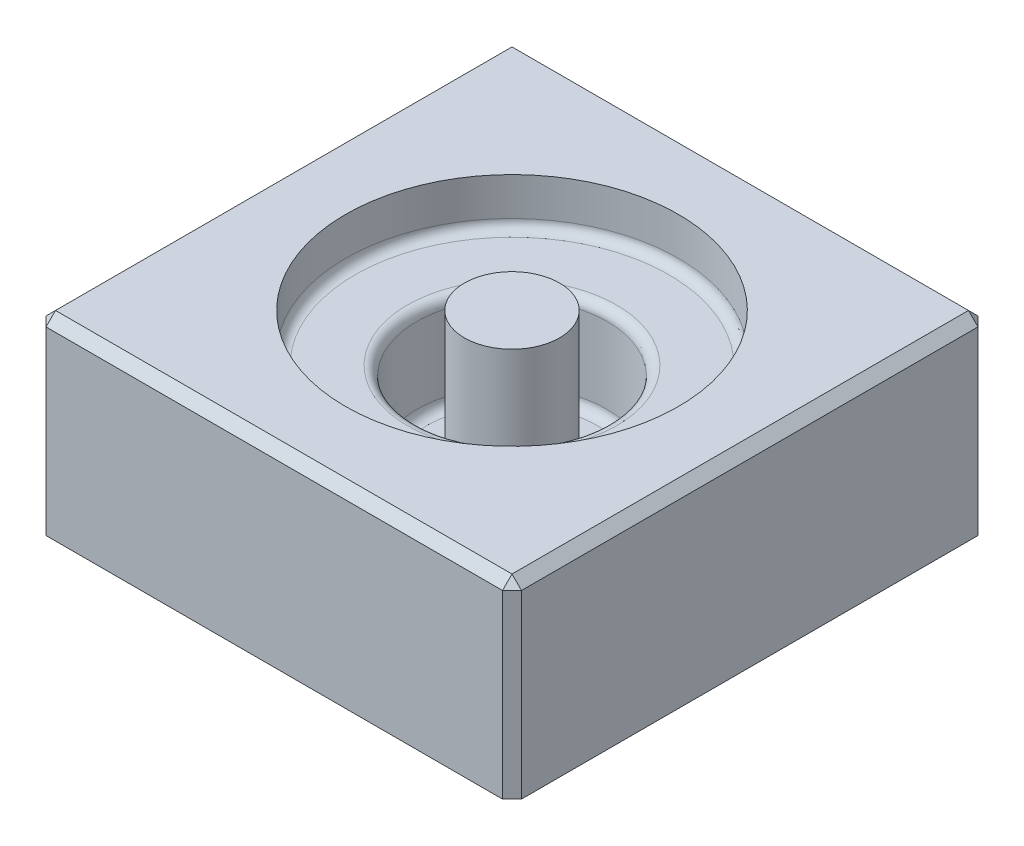
ISO-10303-21;
HEADER;
FILE_DESCRIPTION(('STEP AP214'),'2;1');
FILE_NAME('part.step','',(''),(''),'','','');
FILE_SCHEMA(('AUTOMOTIVE_DESIGN { 1 0 10303 214 1 1 1 1 }'));
ENDSEC;
DATA;
#1=APPLICATION_CONTEXT('core data for automotive mechanical design processes');
#2=APPLICATION_PROTOCOL_DEFINITION('international standard','automotive_design',2000,#1);
#3=PRODUCT_CONTEXT('',#1,'mechanical');
#4=PRODUCT('Part','Part','',(#3));
#5=PRODUCT_RELATED_PRODUCT_CATEGORY('part','',(#4));
#6=PRODUCT_DEFINITION_FORMATION('','',#4);
#7=PRODUCT_DEFINITION_CONTEXT('part definition',#1,'design');
#8=PRODUCT_DEFINITION('design','',#6,#7);
#9=PRODUCT_DEFINITION_SHAPE('','',#8);
#10=(LENGTH_UNIT() NAMED_UNIT(*) SI_UNIT(.MILLI.,.METRE.));
#11=(NAMED_UNIT(*) PLANE_ANGLE_UNIT() SI_UNIT($,.RADIAN.));
#12=(NAMED_UNIT(*) SI_UNIT($,.STERADIAN.) SOLID_ANGLE_UNIT());
#13=UNCERTAINTY_MEASURE_WITH_UNIT(LENGTH_MEASURE(1.E-05),#10,'distance_accuracy_value','');
#14=(GEOMETRIC_REPRESENTATION_CONTEXT(3) GLOBAL_UNCERTAINTY_ASSIGNED_CONTEXT((#13)) GLOBAL_UNIT_ASSIGNED_CONTEXT((#10,
#11,#12)) REPRESENTATION_CONTEXT('',''));
#15=CARTESIAN_POINT('',(0.,0.,0.));
#16=DIRECTION('',(0.,0.,1.));
#17=DIRECTION('',(1.,0.,0.));
#18=AXIS2_PLACEMENT_3D('',#15,#16,#17);
#19=CARTESIAN_POINT('',(31.75,25.4,-31.75));
#20=DIRECTION('',(-1.,0.,0.));
#21=DIRECTION('',(0.,0.,1.));
#22=AXIS2_PLACEMENT_3D('',#19,#20,#21);
#23=PLANE('',#22);
#24=DIRECTION('',(0.,0.,-1.));
#25=VECTOR('',#24,1.);
#26=CARTESIAN_POINT('',(31.75,0.,-31.75));
#27=LINE('',#26,#25);
#28=CARTESIAN_POINT('',(31.75,0.,30.48));
#29=VERTEX_POINT('',#28);
#30=CARTESIAN_POINT('',(31.75,0.,-30.48));
#31=VERTEX_POINT('',#30);
#32=EDGE_CURVE('E238',#29,#31,#27,.T.);
#33=ORIENTED_EDGE('',*,*,#32,.T.);
#34=DIRECTION('',(0.,1.,0.));
#35=VECTOR('',#34,1.);
#36=CARTESIAN_POINT('',(31.75,25.4,-30.48));
#37=LINE('',#36,#35);
#38=CARTESIAN_POINT('',(31.75,24.13,-30.48));
#39=VERTEX_POINT('',#38);
#40=EDGE_CURVE('E189',#31,#39,#37,.T.);
#41=ORIENTED_EDGE('',*,*,#40,.T.);
#42=DIRECTION('',(0.,0.,1.));
#43=VECTOR('',#42,1.);
#44=CARTESIAN_POINT('',(31.75,24.13,31.75));
#45=LINE('',#44,#43);
#46=CARTESIAN_POINT('',(31.75,24.13,30.48));
#47=VERTEX_POINT('',#46);
#48=EDGE_CURVE('E185',#39,#47,#45,.T.);
#49=ORIENTED_EDGE('',*,*,#48,.T.);
#50=DIRECTION('',(0.,-1.,0.));
#51=VECTOR('',#50,1.);
#52=CARTESIAN_POINT('',(31.75,25.4,30.48));
#53=LINE('',#52,#51);
#54=EDGE_CURVE('E187',#47,#29,#53,.T.);
#55=ORIENTED_EDGE('',*,*,#54,.T.);
#56=EDGE_LOOP('',(#33,#41,#49,#55));
#57=FACE_BOUND('',#56,.T.);
#58=ADVANCED_FACE('F33',(#57),#23,.F.);
#59=CARTESIAN_POINT('',(-31.75,25.4,-31.75));
#60=DIRECTION('',(0.,0.,1.));
#61=DIRECTION('',(1.,0.,0.));
#62=AXIS2_PLACEMENT_3D('',#59,#60,#61);
#63=PLANE('',#62);
#64=DIRECTION('',(-1.,0.,0.));
#65=VECTOR('',#64,1.);
#66=CARTESIAN_POINT('',(-31.75,0.,-31.75));
#67=LINE('',#66,#65);
#68=CARTESIAN_POINT('',(30.48,0.,-31.75));
#69=VERTEX_POINT('',#68);
#70=CARTESIAN_POINT('',(-30.48,0.,-31.75));
#71=VERTEX_POINT('',#70);
#72=EDGE_CURVE('E145',#69,#71,#67,.T.);
#73=ORIENTED_EDGE('',*,*,#72,.T.);
#74=DIRECTION('',(0.,1.,0.));
#75=VECTOR('',#74,1.);
#76=CARTESIAN_POINT('',(-30.48,25.4,-31.75));
#77=LINE('',#76,#75);
#78=CARTESIAN_POINT('',(-30.48,24.13,-31.75));
#79=VERTEX_POINT('',#78);
#80=EDGE_CURVE('E183',#71,#79,#77,.T.);
#81=ORIENTED_EDGE('',*,*,#80,.T.);
#82=DIRECTION('',(1.,0.,0.));
#83=VECTOR('',#82,1.);
#84=CARTESIAN_POINT('',(31.75,24.13,-31.75));
#85=LINE('',#84,#83);
#86=CARTESIAN_POINT('',(30.48,24.13,-31.75));
#87=VERTEX_POINT('',#86);
#88=EDGE_CURVE('E179',#79,#87,#85,.T.);
#89=ORIENTED_EDGE('',*,*,#88,.T.);
#90=DIRECTION('',(0.,-1.,0.));
#91=VECTOR('',#90,1.);
#92=CARTESIAN_POINT('',(30.48,25.4,-31.75));
#93=LINE('',#92,#91);
#94=EDGE_CURVE('E181',#87,#69,#93,.T.);
#95=ORIENTED_EDGE('',*,*,#94,.T.);
#96=EDGE_LOOP('',(#73,#81,#89,#95));
#97=FACE_BOUND('',#96,.T.);
#98=ADVANCED_FACE('F246',(#97),#63,.F.);
#99=CARTESIAN_POINT('',(-31.75,25.4,-31.75));
#100=DIRECTION('',(1.,0.,0.));
#101=DIRECTION('',(0.,0.,-1.));
#102=AXIS2_PLACEMENT_3D('',#99,#100,#101);
#103=PLANE('',#102);
#104=DIRECTION('',(0.,0.,1.));
#105=VECTOR('',#104,1.);
#106=CARTESIAN_POINT('',(-31.75,0.,-31.75));
#107=LINE('',#106,#105);
#108=CARTESIAN_POINT('',(-31.75,0.,-30.48));
#109=VERTEX_POINT('',#108);
#110=CARTESIAN_POINT('',(-31.75,0.,30.48));
#111=VERTEX_POINT('',#110);
#112=EDGE_CURVE('E140',#109,#111,#107,.T.);
#113=ORIENTED_EDGE('',*,*,#112,.T.);
#114=DIRECTION('',(0.,1.,0.));
#115=VECTOR('',#114,1.);
#116=CARTESIAN_POINT('',(-31.75,25.4,30.48));
#117=LINE('',#116,#115);
#118=CARTESIAN_POINT('',(-31.75,24.13,30.48));
#119=VERTEX_POINT('',#118);
#120=EDGE_CURVE('E117',#111,#119,#117,.T.);
#121=ORIENTED_EDGE('',*,*,#120,.T.);
#122=DIRECTION('',(0.,0.,-1.));
#123=VECTOR('',#122,1.);
#124=CARTESIAN_POINT('',(-31.75,24.13,-31.75));
#125=LINE('',#124,#123);
#126=CARTESIAN_POINT('',(-31.75,24.13,-30.48));
#127=VERTEX_POINT('',#126);
#128=EDGE_CURVE('E122',#119,#127,#125,.T.);
#129=ORIENTED_EDGE('',*,*,#128,.T.);
#130=DIRECTION('',(0.,-1.,0.));
#131=VECTOR('',#130,1.);
#132=CARTESIAN_POINT('',(-31.75,25.4,-30.48));
#133=LINE('',#132,#131);
#134=EDGE_CURVE('E176',#127,#109,#133,.T.);
#135=ORIENTED_EDGE('',*,*,#134,.T.);
#136=EDGE_LOOP('',(#113,#121,#129,#135));
#137=FACE_BOUND('',#136,.T.);
#138=ADVANCED_FACE('F283',(#137),#103,.F.);
#139=CARTESIAN_POINT('',(-31.75,25.4,31.75));
#140=DIRECTION('',(0.,0.,-1.));
#141=DIRECTION('',(-1.,0.,0.));
#142=AXIS2_PLACEMENT_3D('',#139,#140,#141);
#143=PLANE('',#142);
#144=DIRECTION('',(-1.,0.,0.));
#145=VECTOR('',#144,1.);
#146=CARTESIAN_POINT('',(-31.75,24.13,31.75));
#147=LINE('',#146,#145);
#148=CARTESIAN_POINT('',(30.48,24.13,31.75));
#149=VERTEX_POINT('',#148);
#150=CARTESIAN_POINT('',(-30.48,24.13,31.75));
#151=VERTEX_POINT('',#150);
#152=EDGE_CURVE('E131',#149,#151,#147,.T.);
#153=ORIENTED_EDGE('',*,*,#152,.T.);
#154=DIRECTION('',(0.,-1.,0.));
#155=VECTOR('',#154,1.);
#156=CARTESIAN_POINT('',(-30.48,25.4,31.75));
#157=LINE('',#156,#155);
#158=CARTESIAN_POINT('',(-30.48,0.,31.75));
#159=VERTEX_POINT('',#158);
#160=EDGE_CURVE('E116',#151,#159,#157,.T.);
#161=ORIENTED_EDGE('',*,*,#160,.T.);
#162=DIRECTION('',(1.,0.,0.));
#163=VECTOR('',#162,1.);
#164=CARTESIAN_POINT('',(-31.75,0.,31.75));
#165=LINE('',#164,#163);
#166=CARTESIAN_POINT('',(30.48,0.,31.75));
#167=VERTEX_POINT('',#166);
#168=EDGE_CURVE('E128',#159,#167,#165,.T.);
#169=ORIENTED_EDGE('',*,*,#168,.T.);
#170=DIRECTION('',(0.,1.,0.));
#171=VECTOR('',#170,1.);
#172=CARTESIAN_POINT('',(30.48,25.4,31.75));
#173=LINE('',#172,#171);
#174=EDGE_CURVE('E134',#167,#149,#173,.T.);
#175=ORIENTED_EDGE('',*,*,#174,.T.);
#176=EDGE_LOOP('',(#153,#161,#169,#175));
#177=FACE_BOUND('',#176,.T.);
#178=ADVANCED_FACE('F127',(#177),#143,.F.);
#179=CARTESIAN_POINT('',(0.,25.4,0.));
#180=DIRECTION('',(0.,1.,0.));
#181=DIRECTION('',(0.,0.,1.));
#182=AXIS2_PLACEMENT_3D('',#179,#180,#181);
#183=PLANE('',#182);
#184=DIRECTION('',(0.,0.,-1.));
#185=VECTOR('',#184,1.);
#186=CARTESIAN_POINT('',(30.48,25.4,-31.75));
#187=LINE('',#186,#185);
#188=CARTESIAN_POINT('',(30.48,25.4,30.48));
#189=VERTEX_POINT('',#188);
#190=CARTESIAN_POINT('',(30.48,25.4,-30.48));
#191=VERTEX_POINT('',#190);
#192=EDGE_CURVE('E42',#189,#191,#187,.T.);
#193=ORIENTED_EDGE('',*,*,#192,.T.);
#194=DIRECTION('',(-1.,0.,0.));
#195=VECTOR('',#194,1.);
#196=CARTESIAN_POINT('',(-31.75,25.4,-30.48));
#197=LINE('',#196,#195);
#198=CARTESIAN_POINT('',(-30.48,25.4,-30.48));
#199=VERTEX_POINT('',#198);
#200=EDGE_CURVE('E11',#191,#199,#197,.T.);
#201=ORIENTED_EDGE('',*,*,#200,.T.);
#202=DIRECTION('',(0.,0.,1.));
#203=VECTOR('',#202,1.);
#204=CARTESIAN_POINT('',(-30.48,25.4,31.75));
#205=LINE('',#204,#203);
#206=CARTESIAN_POINT('',(-30.48,25.4,30.48));
#207=VERTEX_POINT('',#206);
#208=EDGE_CURVE('E56',#199,#207,#205,.T.);
#209=ORIENTED_EDGE('',*,*,#208,.T.);
#210=DIRECTION('',(1.,0.,0.));
#211=VECTOR('',#210,1.);
#212=CARTESIAN_POINT('',(31.75,25.4,30.48));
#213=LINE('',#212,#211);
#214=EDGE_CURVE('E191',#207,#189,#213,.T.);
#215=ORIENTED_EDGE('',*,*,#214,.T.);
#216=EDGE_LOOP('',(#193,#201,#209,#215));
#217=FACE_BOUND('',#216,.T.);
#218=CARTESIAN_POINT('',(0.,25.4,0.));
#219=DIRECTION('',(0.,1.,0.));
#220=DIRECTION('',(0.,0.,1.));
#221=AXIS2_PLACEMENT_3D('',#218,#219,#220);
#222=CIRCLE('',#221,22.225);
#223=CARTESIAN_POINT('',(0.,25.4,22.225));
#224=VERTEX_POINT('',#223);
#225=EDGE_CURVE('E233',#224,#224,#222,.T.);
#226=ORIENTED_EDGE('',*,*,#225,.F.);
#227=EDGE_LOOP('',(#226));
#228=FACE_BOUND('',#227,.T.);
#229=ADVANCED_FACE('F258',(#217,#228),#183,.T.);
#230=CARTESIAN_POINT('',(0.,0.,0.));
#231=DIRECTION('',(0.,1.,0.));
#232=DIRECTION('',(0.,0.,1.));
#233=AXIS2_PLACEMENT_3D('',#230,#231,#232);
#234=PLANE('',#233);
#235=ORIENTED_EDGE('',*,*,#168,.F.);
#236=DIRECTION('',(0.707106781186548,0.,0.707106781186548));
#237=VECTOR('',#236,1.);
#238=CARTESIAN_POINT('',(-30.48,0.,31.75));
#239=LINE('',#238,#237);
#240=EDGE_CURVE('E112',#159,#111,#239,.F.);
#241=ORIENTED_EDGE('',*,*,#240,.T.);
#242=ORIENTED_EDGE('',*,*,#112,.F.);
#243=DIRECTION('',(-0.707106781186548,0.,0.707106781186548));
#244=VECTOR('',#243,1.);
#245=CARTESIAN_POINT('',(-31.75,0.,-30.48));
#246=LINE('',#245,#244);
#247=EDGE_CURVE('E123',#109,#71,#246,.F.);
#248=ORIENTED_EDGE('',*,*,#247,.T.);
#249=ORIENTED_EDGE('',*,*,#72,.F.);
#250=DIRECTION('',(-0.707106781186548,0.,-0.707106781186548));
#251=VECTOR('',#250,1.);
#252=CARTESIAN_POINT('',(30.48,0.,-31.75));
#253=LINE('',#252,#251);
#254=EDGE_CURVE('E172',#69,#31,#253,.F.);
#255=ORIENTED_EDGE('',*,*,#254,.T.);
#256=ORIENTED_EDGE('',*,*,#32,.F.);
#257=DIRECTION('',(0.707106781186548,0.,-0.707106781186548));
#258=VECTOR('',#257,1.);
#259=CARTESIAN_POINT('',(31.75,0.,30.48));
#260=LINE('',#259,#258);
#261=EDGE_CURVE('E133',#29,#167,#260,.F.);
#262=ORIENTED_EDGE('',*,*,#261,.T.);
#263=EDGE_LOOP('',(#235,#241,#242,#248,#249,#255,#256,#262));
#264=FACE_BOUND('',#263,.T.);
#265=ADVANCED_FACE('F136',(#264),#234,.F.);
#266=CARTESIAN_POINT('',(0.,19.05,0.));
#267=DIRECTION('',(0.,1.,0.));
#268=DIRECTION('',(0.,0.,1.));
#269=AXIS2_PLACEMENT_3D('',#266,#267,#268);
#270=CYLINDRICAL_SURFACE('',#269,22.225);
#271=CARTESIAN_POINT('',(0.,20.32,0.));
#272=DIRECTION('',(0.,1.,0.));
#273=DIRECTION('',(0.,0.,1.));
#274=AXIS2_PLACEMENT_3D('',#271,#272,#273);
#275=CIRCLE('',#274,22.225);
#276=CARTESIAN_POINT('',(0.,20.32,22.225));
#277=VERTEX_POINT('',#276);
#278=EDGE_CURVE('E160',#277,#277,#275,.F.);
#279=ORIENTED_EDGE('',*,*,#278,.T.);
#280=EDGE_LOOP('',(#279));
#281=FACE_BOUND('',#280,.T.);
#282=ORIENTED_EDGE('',*,*,#225,.T.);
#283=EDGE_LOOP('',(#282));
#284=FACE_BOUND('',#283,.T.);
#285=ADVANCED_FACE('F331',(#281,#284),#270,.F.);
#286=CARTESIAN_POINT('',(0.,19.05,0.));
#287=DIRECTION('',(0.,1.,0.));
#288=DIRECTION('',(0.,0.,1.));
#289=AXIS2_PLACEMENT_3D('',#286,#287,#288);
#290=PLANE('',#289);
#291=CARTESIAN_POINT('',(0.,19.05,0.));
#292=DIRECTION('',(0.,1.,0.));
#293=DIRECTION('',(0.,0.,1.));
#294=AXIS2_PLACEMENT_3D('',#291,#292,#293);
#295=CIRCLE('',#294,20.955);
#296=CARTESIAN_POINT('',(0.,19.05,20.955));
#297=VERTEX_POINT('',#296);
#298=EDGE_CURVE('E157',#297,#297,#295,.T.);
#299=ORIENTED_EDGE('',*,*,#298,.T.);
#300=EDGE_LOOP('',(#299));
#301=FACE_BOUND('',#300,.T.);
#302=CARTESIAN_POINT('',(0.,19.05,0.));
#303=DIRECTION('',(0.,1.,0.));
#304=DIRECTION('',(0.,0.,1.));
#305=AXIS2_PLACEMENT_3D('',#302,#303,#304);
#306=CIRCLE('',#305,13.97);
#307=CARTESIAN_POINT('',(0.,19.05,13.97));
#308=VERTEX_POINT('',#307);
#309=EDGE_CURVE('E154',#308,#308,#306,.F.);
#310=ORIENTED_EDGE('',*,*,#309,.T.);
#311=EDGE_LOOP('',(#310));
#312=FACE_BOUND('',#311,.T.);
#313=ADVANCED_FACE('F324',(#301,#312),#290,.T.);
#314=CARTESIAN_POINT('',(0.,6.35,0.));
#315=DIRECTION('',(0.,1.,0.));
#316=DIRECTION('',(0.,0.,1.));
#317=AXIS2_PLACEMENT_3D('',#314,#315,#316);
#318=CYLINDRICAL_SURFACE('',#317,12.7);
#319=CARTESIAN_POINT('',(0.,17.78,0.));
#320=DIRECTION('',(0.,1.,0.));
#321=DIRECTION('',(0.,0.,1.));
#322=AXIS2_PLACEMENT_3D('',#319,#320,#321);
#323=CIRCLE('',#322,12.7);
#324=CARTESIAN_POINT('',(0.,17.78,12.7));
#325=VERTEX_POINT('',#324);
#326=EDGE_CURVE('E166',#325,#325,#323,.T.);
#327=ORIENTED_EDGE('',*,*,#326,.T.);
#328=EDGE_LOOP('',(#327));
#329=FACE_BOUND('',#328,.T.);
#330=CARTESIAN_POINT('',(0.,7.62,0.));
#331=DIRECTION('',(0.,1.,0.));
#332=DIRECTION('',(0.,0.,1.));
#333=AXIS2_PLACEMENT_3D('',#330,#331,#332);
#334=CIRCLE('',#333,12.7);
#335=CARTESIAN_POINT('',(0.,7.62,12.7));
#336=VERTEX_POINT('',#335);
#337=EDGE_CURVE('E163',#336,#336,#334,.F.);
#338=ORIENTED_EDGE('',*,*,#337,.T.);
#339=EDGE_LOOP('',(#338));
#340=FACE_BOUND('',#339,.T.);
#341=ADVANCED_FACE('F315',(#329,#340),#318,.F.);
#342=CARTESIAN_POINT('',(0.,6.35,0.));
#343=DIRECTION('',(0.,1.,0.));
#344=DIRECTION('',(0.,0.,1.));
#345=AXIS2_PLACEMENT_3D('',#342,#343,#344);
#346=PLANE('',#345);
#347=CARTESIAN_POINT('',(0.,6.35,0.));
#348=DIRECTION('',(0.,1.,0.));
#349=DIRECTION('',(0.,0.,1.));
#350=AXIS2_PLACEMENT_3D('',#347,#348,#349);
#351=CIRCLE('',#350,7.62);
#352=CARTESIAN_POINT('',(0.,6.35,7.62));
#353=VERTEX_POINT('',#352);
#354=EDGE_CURVE('E151',#353,#353,#351,.F.);
#355=ORIENTED_EDGE('',*,*,#354,.T.);
#356=EDGE_LOOP('',(#355));
#357=FACE_BOUND('',#356,.T.);
#358=CARTESIAN_POINT('',(0.,6.35,0.));
#359=DIRECTION('',(0.,1.,0.));
#360=DIRECTION('',(0.,0.,1.));
#361=AXIS2_PLACEMENT_3D('',#358,#359,#360);
#362=CIRCLE('',#361,11.43);
#363=CARTESIAN_POINT('',(0.,6.35,11.43));
#364=VERTEX_POINT('',#363);
#365=EDGE_CURVE('E143',#364,#364,#362,.T.);
#366=ORIENTED_EDGE('',*,*,#365,.T.);
#367=EDGE_LOOP('',(#366));
#368=FACE_BOUND('',#367,.T.);
#369=ADVANCED_FACE('F312',(#357,#368),#346,.T.);
#370=CARTESIAN_POINT('',(0.,43.3605122421383,0.));
#371=DIRECTION('',(0.,-1.,0.));
#372=DIRECTION('',(0.,0.,-1.));
#373=AXIS2_PLACEMENT_3D('',#370,#371,#372);
#374=CYLINDRICAL_SURFACE('',#373,6.35);
#375=CARTESIAN_POINT('',(0.,7.62,0.));
#376=DIRECTION('',(0.,1.,0.));
#377=DIRECTION('',(0.,0.,1.));
#378=AXIS2_PLACEMENT_3D('',#375,#376,#377);
#379=CIRCLE('',#378,6.35);
#380=CARTESIAN_POINT('',(0.,7.62,6.35));
#381=VERTEX_POINT('',#380);
#382=EDGE_CURVE('E139',#381,#381,#379,.T.);
#383=ORIENTED_EDGE('',*,*,#382,.T.);
#384=EDGE_LOOP('',(#383));
#385=FACE_BOUND('',#384,.T.);
#386=CARTESIAN_POINT('',(0.,25.4,0.));
#387=DIRECTION('',(0.,1.,0.));
#388=DIRECTION('',(0.,0.,1.));
#389=AXIS2_PLACEMENT_3D('',#386,#387,#388);
#390=CIRCLE('',#389,6.35);
#391=CARTESIAN_POINT('',(0.,25.4,6.35));
#392=VERTEX_POINT('',#391);
#393=EDGE_CURVE('E228',#392,#392,#390,.T.);
#394=ORIENTED_EDGE('',*,*,#393,.F.);
#395=EDGE_LOOP('',(#394));
#396=FACE_BOUND('',#395,.T.);
#397=ADVANCED_FACE('F314',(#385,#396),#374,.T.);
#398=CARTESIAN_POINT('',(0.,25.4,0.));
#399=DIRECTION('',(0.,1.,0.));
#400=DIRECTION('',(0.,0.,1.));
#401=AXIS2_PLACEMENT_3D('',#398,#399,#400);
#402=PLANE('',#401);
#403=ORIENTED_EDGE('',*,*,#393,.T.);
#404=EDGE_LOOP('',(#403));
#405=FACE_BOUND('',#404,.T.);
#406=ADVANCED_FACE('F291',(#405),#402,.T.);
#407=CARTESIAN_POINT('',(0.,7.62,0.));
#408=DIRECTION('',(0.,1.,0.));
#409=DIRECTION('',(0.,0.,1.));
#410=AXIS2_PLACEMENT_3D('',#407,#408,#409);
#411=TOROIDAL_SURFACE('',#410,7.62,1.27);
#412=ORIENTED_EDGE('',*,*,#354,.F.);
#413=EDGE_LOOP('',(#412));
#414=FACE_BOUND('',#413,.T.);
#415=ORIENTED_EDGE('',*,*,#382,.F.);
#416=EDGE_LOOP('',(#415));
#417=FACE_BOUND('',#416,.T.);
#418=ADVANCED_FACE('F287',(#414,#417),#411,.F.);
#419=CARTESIAN_POINT('',(0.,20.32,0.));
#420=DIRECTION('',(0.,1.,0.));
#421=DIRECTION('',(0.,0.,1.));
#422=AXIS2_PLACEMENT_3D('',#419,#420,#421);
#423=TOROIDAL_SURFACE('',#422,20.955,1.27);
#424=ORIENTED_EDGE('',*,*,#278,.F.);
#425=EDGE_LOOP('',(#424));
#426=FACE_BOUND('',#425,.T.);
#427=ORIENTED_EDGE('',*,*,#298,.F.);
#428=EDGE_LOOP('',(#427));
#429=FACE_BOUND('',#428,.T.);
#430=ADVANCED_FACE('F290',(#426,#429),#423,.F.);
#431=CARTESIAN_POINT('',(0.,17.78,0.));
#432=DIRECTION('',(0.,1.,0.));
#433=DIRECTION('',(0.,0.,1.));
#434=AXIS2_PLACEMENT_3D('',#431,#432,#433);
#435=TOROIDAL_SURFACE('',#434,13.97,1.27);
#436=ORIENTED_EDGE('',*,*,#309,.F.);
#437=EDGE_LOOP('',(#436));
#438=FACE_BOUND('',#437,.T.);
#439=ORIENTED_EDGE('',*,*,#326,.F.);
#440=EDGE_LOOP('',(#439));
#441=FACE_BOUND('',#440,.T.);
#442=ADVANCED_FACE('F295',(#438,#441),#435,.T.);
#443=CARTESIAN_POINT('',(0.,7.62,0.));
#444=DIRECTION('',(0.,1.,0.));
#445=DIRECTION('',(0.,0.,1.));
#446=AXIS2_PLACEMENT_3D('',#443,#444,#445);
#447=TOROIDAL_SURFACE('',#446,11.43,1.27);
#448=ORIENTED_EDGE('',*,*,#337,.F.);
#449=EDGE_LOOP('',(#448));
#450=FACE_BOUND('',#449,.T.);
#451=ORIENTED_EDGE('',*,*,#365,.F.);
#452=EDGE_LOOP('',(#451));
#453=FACE_BOUND('',#452,.T.);
#454=ADVANCED_FACE('F299',(#450,#453),#447,.F.);
#455=CARTESIAN_POINT('',(30.48,25.4,-31.75));
#456=DIRECTION('',(-0.707106781186548,0.,0.707106781186548));
#457=DIRECTION('',(0.,-1.,0.));
#458=AXIS2_PLACEMENT_3D('',#455,#456,#457);
#459=PLANE('',#458);
#460=DIRECTION('',(0.707106781186547,0.,0.707106781186547));
#461=VECTOR('',#460,1.);
#462=CARTESIAN_POINT('',(31.75,24.13,-30.48));
#463=LINE('',#462,#461);
#464=EDGE_CURVE('E37',#39,#87,#463,.F.);
#465=ORIENTED_EDGE('',*,*,#464,.F.);
#466=ORIENTED_EDGE('',*,*,#40,.F.);
#467=ORIENTED_EDGE('',*,*,#254,.F.);
#468=ORIENTED_EDGE('',*,*,#94,.F.);
#469=EDGE_LOOP('',(#465,#466,#467,#468));
#470=FACE_BOUND('',#469,.T.);
#471=ADVANCED_FACE('F35',(#470),#459,.F.);
#472=CARTESIAN_POINT('',(31.75,24.13,-30.48));
#473=DIRECTION('',(0.577350269189626,0.577350269189626,-0.577350269189626));
#474=DIRECTION('',(-0.707106781186548,0.,-0.707106781186548));
#475=AXIS2_PLACEMENT_3D('',#472,#473,#474);
#476=PLANE('',#475);
#477=DIRECTION('',(0.707106781186548,-0.707106781186548,0.));
#478=VECTOR('',#477,1.);
#479=CARTESIAN_POINT('',(31.75,24.13,-30.48));
#480=LINE('',#479,#478);
#481=EDGE_CURVE('E220',#39,#191,#480,.F.);
#482=ORIENTED_EDGE('',*,*,#481,.F.);
#483=ORIENTED_EDGE('',*,*,#464,.T.);
#484=DIRECTION('',(0.,0.707106781186547,0.707106781186547));
#485=VECTOR('',#484,1.);
#486=CARTESIAN_POINT('',(30.48,24.765,-31.115));
#487=LINE('',#486,#485);
#488=EDGE_CURVE('E221',#191,#87,#487,.F.);
#489=ORIENTED_EDGE('',*,*,#488,.F.);
#490=EDGE_LOOP('',(#482,#483,#489));
#491=FACE_BOUND('',#490,.T.);
#492=ADVANCED_FACE('F306',(#491),#476,.T.);
#493=CARTESIAN_POINT('',(-31.75,25.4,-30.48));
#494=DIRECTION('',(0.707106781186548,0.,0.707106781186548));
#495=DIRECTION('',(0.,-1.,0.));
#496=AXIS2_PLACEMENT_3D('',#493,#494,#495);
#497=PLANE('',#496);
#498=ORIENTED_EDGE('',*,*,#247,.F.);
#499=ORIENTED_EDGE('',*,*,#134,.F.);
#500=DIRECTION('',(0.707106781186547,0.,-0.707106781186547));
#501=VECTOR('',#500,1.);
#502=CARTESIAN_POINT('',(-30.48,24.13,-31.75));
#503=LINE('',#502,#501);
#504=EDGE_CURVE('E217',#79,#127,#503,.F.);
#505=ORIENTED_EDGE('',*,*,#504,.F.);
#506=ORIENTED_EDGE('',*,*,#80,.F.);
#507=EDGE_LOOP('',(#498,#499,#505,#506));
#508=FACE_BOUND('',#507,.T.);
#509=ADVANCED_FACE('F252',(#508),#497,.F.);
#510=CARTESIAN_POINT('',(0.,25.4,-30.48));
#511=DIRECTION('',(0.,0.707106781186548,-0.707106781186548));
#512=DIRECTION('',(1.,0.,0.));
#513=AXIS2_PLACEMENT_3D('',#510,#511,#512);
#514=PLANE('',#513);
#515=ORIENTED_EDGE('',*,*,#488,.T.);
#516=ORIENTED_EDGE('',*,*,#88,.F.);
#517=DIRECTION('',(0.,-0.707106781186547,-0.707106781186547));
#518=VECTOR('',#517,1.);
#519=CARTESIAN_POINT('',(-30.48,24.13,-31.75));
#520=LINE('',#519,#518);
#521=EDGE_CURVE('E214',#199,#79,#520,.T.);
#522=ORIENTED_EDGE('',*,*,#521,.F.);
#523=ORIENTED_EDGE('',*,*,#200,.F.);
#524=EDGE_LOOP('',(#515,#516,#522,#523));
#525=FACE_BOUND('',#524,.T.);
#526=ADVANCED_FACE('F257',(#525),#514,.T.);
#527=CARTESIAN_POINT('',(30.48,25.4,0.));
#528=DIRECTION('',(0.707106781186548,0.707106781186548,0.));
#529=DIRECTION('',(0.,0.,1.));
#530=AXIS2_PLACEMENT_3D('',#527,#528,#529);
#531=PLANE('',#530);
#532=ORIENTED_EDGE('',*,*,#481,.T.);
#533=ORIENTED_EDGE('',*,*,#192,.F.);
#534=DIRECTION('',(-0.707106781186547,0.707106781186547,0.));
#535=VECTOR('',#534,1.);
#536=CARTESIAN_POINT('',(31.115,24.765,30.48));
#537=LINE('',#536,#535);
#538=EDGE_CURVE('E211',#47,#189,#537,.T.);
#539=ORIENTED_EDGE('',*,*,#538,.F.);
#540=ORIENTED_EDGE('',*,*,#48,.F.);
#541=EDGE_LOOP('',(#532,#533,#539,#540));
#542=FACE_BOUND('',#541,.T.);
#543=ADVANCED_FACE('F454',(#542),#531,.T.);
#544=CARTESIAN_POINT('',(31.75,25.4,30.48));
#545=DIRECTION('',(-0.707106781186548,0.,-0.707106781186548));
#546=DIRECTION('',(0.,-1.,0.));
#547=AXIS2_PLACEMENT_3D('',#544,#545,#546);
#548=PLANE('',#547);
#549=ORIENTED_EDGE('',*,*,#261,.F.);
#550=ORIENTED_EDGE('',*,*,#54,.F.);
#551=DIRECTION('',(-0.707106781186547,0.,0.707106781186547));
#552=VECTOR('',#551,1.);
#553=CARTESIAN_POINT('',(30.48,24.13,31.75));
#554=LINE('',#553,#552);
#555=EDGE_CURVE('E208',#149,#47,#554,.F.);
#556=ORIENTED_EDGE('',*,*,#555,.F.);
#557=ORIENTED_EDGE('',*,*,#174,.F.);
#558=EDGE_LOOP('',(#549,#550,#556,#557));
#559=FACE_BOUND('',#558,.T.);
#560=ADVANCED_FACE('F462',(#559),#548,.F.);
#561=CARTESIAN_POINT('',(-30.48,24.13,-31.75));
#562=DIRECTION('',(-0.577350269189626,0.577350269189626,-0.577350269189626));
#563=DIRECTION('',(-0.707106781186548,0.,0.707106781186548));
#564=AXIS2_PLACEMENT_3D('',#561,#562,#563);
#565=PLANE('',#564);
#566=ORIENTED_EDGE('',*,*,#521,.T.);
#567=ORIENTED_EDGE('',*,*,#504,.T.);
#568=DIRECTION('',(0.707106781186547,0.707106781186547,0.));
#569=VECTOR('',#568,1.);
#570=CARTESIAN_POINT('',(-31.115,24.765,-30.48));
#571=LINE('',#570,#569);
#572=EDGE_CURVE('E206',#199,#127,#571,.F.);
#573=ORIENTED_EDGE('',*,*,#572,.F.);
#574=EDGE_LOOP('',(#566,#567,#573));
#575=FACE_BOUND('',#574,.T.);
#576=ADVANCED_FACE('F256',(#575),#565,.T.);
#577=CARTESIAN_POINT('',(30.48,24.13,31.75));
#578=DIRECTION('',(0.577350269189626,0.577350269189626,0.577350269189626));
#579=DIRECTION('',(0.707106781186548,0.,-0.707106781186548));
#580=AXIS2_PLACEMENT_3D('',#577,#578,#579);
#581=PLANE('',#580);
#582=ORIENTED_EDGE('',*,*,#555,.T.);
#583=ORIENTED_EDGE('',*,*,#538,.T.);
#584=DIRECTION('',(0.,-0.707106781186547,0.707106781186547));
#585=VECTOR('',#584,1.);
#586=CARTESIAN_POINT('',(30.48,24.13,31.75));
#587=LINE('',#586,#585);
#588=EDGE_CURVE('E203',#149,#189,#587,.F.);
#589=ORIENTED_EDGE('',*,*,#588,.F.);
#590=EDGE_LOOP('',(#582,#583,#589));
#591=FACE_BOUND('',#590,.T.);
#592=ADVANCED_FACE('F479',(#591),#581,.T.);
#593=CARTESIAN_POINT('',(-30.48,25.4,0.));
#594=DIRECTION('',(-0.707106781186548,0.707106781186548,0.));
#595=DIRECTION('',(0.,0.,-1.));
#596=AXIS2_PLACEMENT_3D('',#593,#594,#595);
#597=PLANE('',#596);
#598=ORIENTED_EDGE('',*,*,#572,.T.);
#599=ORIENTED_EDGE('',*,*,#128,.F.);
#600=DIRECTION('',(-0.707106781186548,-0.707106781186548,0.));
#601=VECTOR('',#600,1.);
#602=CARTESIAN_POINT('',(-31.75,24.13,30.48));
#603=LINE('',#602,#601);
#604=EDGE_CURVE('E200',#207,#119,#603,.T.);
#605=ORIENTED_EDGE('',*,*,#604,.F.);
#606=ORIENTED_EDGE('',*,*,#208,.F.);
#607=EDGE_LOOP('',(#598,#599,#605,#606));
#608=FACE_BOUND('',#607,.T.);
#609=ADVANCED_FACE('F266',(#608),#597,.T.);
#610=CARTESIAN_POINT('',(0.,25.4,30.48));
#611=DIRECTION('',(0.,0.707106781186548,0.707106781186548));
#612=DIRECTION('',(-1.,0.,0.));
#613=AXIS2_PLACEMENT_3D('',#610,#611,#612);
#614=PLANE('',#613);
#615=ORIENTED_EDGE('',*,*,#588,.T.);
#616=ORIENTED_EDGE('',*,*,#214,.F.);
#617=DIRECTION('',(0.,0.707106781186547,-0.707106781186547));
#618=VECTOR('',#617,1.);
#619=CARTESIAN_POINT('',(-30.48,24.765,31.115));
#620=LINE('',#619,#618);
#621=EDGE_CURVE('E197',#151,#207,#620,.T.);
#622=ORIENTED_EDGE('',*,*,#621,.F.);
#623=ORIENTED_EDGE('',*,*,#152,.F.);
#624=EDGE_LOOP('',(#615,#616,#622,#623));
#625=FACE_BOUND('',#624,.T.);
#626=ADVANCED_FACE('F262',(#625),#614,.T.);
#627=CARTESIAN_POINT('',(-31.75,24.13,30.48));
#628=DIRECTION('',(-0.577350269189626,0.577350269189626,0.577350269189626));
#629=DIRECTION('',(0.707106781186548,0.,0.707106781186548));
#630=AXIS2_PLACEMENT_3D('',#627,#628,#629);
#631=PLANE('',#630);
#632=ORIENTED_EDGE('',*,*,#621,.T.);
#633=ORIENTED_EDGE('',*,*,#604,.T.);
#634=DIRECTION('',(-0.707106781186547,0.,-0.707106781186547));
#635=VECTOR('',#634,1.);
#636=CARTESIAN_POINT('',(-31.75,24.13,30.48));
#637=LINE('',#636,#635);
#638=EDGE_CURVE('E195',#151,#119,#637,.T.);
#639=ORIENTED_EDGE('',*,*,#638,.F.);
#640=EDGE_LOOP('',(#632,#633,#639));
#641=FACE_BOUND('',#640,.T.);
#642=ADVANCED_FACE('F268',(#641),#631,.T.);
#643=CARTESIAN_POINT('',(-30.48,25.4,31.75));
#644=DIRECTION('',(0.707106781186548,0.,-0.707106781186548));
#645=DIRECTION('',(0.,-1.,0.));
#646=AXIS2_PLACEMENT_3D('',#643,#644,#645);
#647=PLANE('',#646);
#648=ORIENTED_EDGE('',*,*,#638,.T.);
#649=ORIENTED_EDGE('',*,*,#120,.F.);
#650=ORIENTED_EDGE('',*,*,#240,.F.);
#651=ORIENTED_EDGE('',*,*,#160,.F.);
#652=EDGE_LOOP('',(#648,#649,#650,#651));
#653=FACE_BOUND('',#652,.T.);
#654=ADVANCED_FACE('F115',(#653),#647,.F.);
#655=CLOSED_SHELL('',(#58,#98,#138,#178,#229,#265,#285,#313,#341,#369,#397,#406,#418,#430,#442,
#454,#471,#492,#509,#526,#543,#560,#576,#592,#609,#626,#642,#654));
#656=MANIFOLD_SOLID_BREP('B2',#655);
#657=ADVANCED_BREP_SHAPE_REPRESENTATION('',(#18,#656),#14);
#658=SHAPE_DEFINITION_REPRESENTATION(#9,#657);
ENDSEC;
END-ISO-10303-21;
